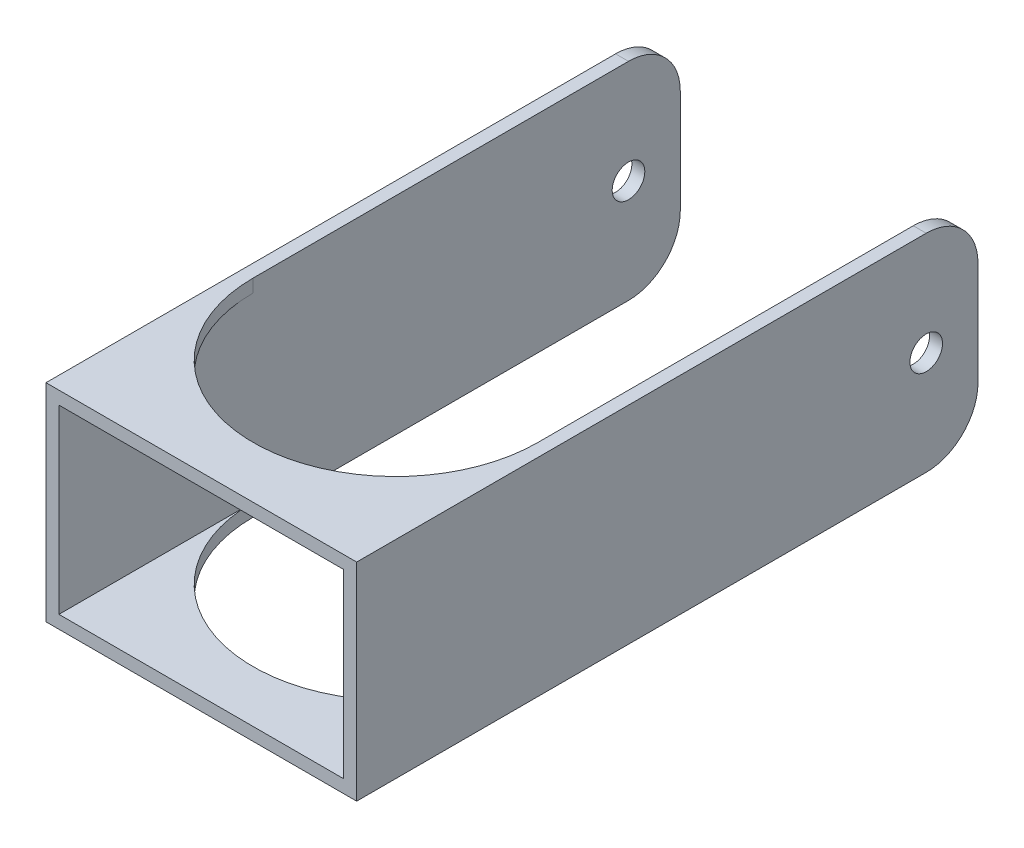
ISO-10303-21;
HEADER;
FILE_DESCRIPTION(('STEP AP214'),'2;1');
FILE_NAME('part.step','',(''),(''),'','','');
FILE_SCHEMA(('AUTOMOTIVE_DESIGN { 1 0 10303 214 1 1 1 1 }'));
ENDSEC;
DATA;
#1=APPLICATION_CONTEXT('core data for automotive mechanical design processes');
#2=APPLICATION_PROTOCOL_DEFINITION('international standard','automotive_design',2000,#1);
#3=PRODUCT_CONTEXT('',#1,'mechanical');
#4=PRODUCT('Part','Part','',(#3));
#5=PRODUCT_RELATED_PRODUCT_CATEGORY('part','',(#4));
#6=PRODUCT_DEFINITION_FORMATION('','',#4);
#7=PRODUCT_DEFINITION_CONTEXT('part definition',#1,'design');
#8=PRODUCT_DEFINITION('design','',#6,#7);
#9=PRODUCT_DEFINITION_SHAPE('','',#8);
#10=(LENGTH_UNIT() NAMED_UNIT(*) SI_UNIT(.MILLI.,.METRE.));
#11=(NAMED_UNIT(*) PLANE_ANGLE_UNIT() SI_UNIT($,.RADIAN.));
#12=(NAMED_UNIT(*) SI_UNIT($,.STERADIAN.) SOLID_ANGLE_UNIT());
#13=UNCERTAINTY_MEASURE_WITH_UNIT(LENGTH_MEASURE(1.E-05),#10,'distance_accuracy_value','');
#14=(GEOMETRIC_REPRESENTATION_CONTEXT(3) GLOBAL_UNCERTAINTY_ASSIGNED_CONTEXT((#13)) GLOBAL_UNIT_ASSIGNED_CONTEXT((#10,
#11,#12)) REPRESENTATION_CONTEXT('',''));
#15=CARTESIAN_POINT('',(0.,0.,0.));
#16=DIRECTION('',(0.,0.,1.));
#17=DIRECTION('',(1.,0.,0.));
#18=AXIS2_PLACEMENT_3D('',#15,#16,#17);
#19=CARTESIAN_POINT('',(0.,0.,-76.2));
#20=DIRECTION('',(0.,0.,1.));
#21=DIRECTION('',(1.,0.,0.));
#22=AXIS2_PLACEMENT_3D('',#19,#20,#21);
#23=PLANE('',#22);
#24=DIRECTION('',(0.,1.,0.));
#25=VECTOR('',#24,1.);
#26=CARTESIAN_POINT('',(38.1,-25.4,-76.2));
#27=LINE('',#26,#25);
#28=CARTESIAN_POINT('',(38.1,-12.7,-76.2));
#29=VERTEX_POINT('',#28);
#30=CARTESIAN_POINT('',(38.1,12.7,-76.2));
#31=VERTEX_POINT('',#30);
#32=EDGE_CURVE('E219',#29,#31,#27,.T.);
#33=ORIENTED_EDGE('',*,*,#32,.F.);
#34=DIRECTION('',(1.,0.,0.));
#35=VECTOR('',#34,1.);
#36=CARTESIAN_POINT('',(0.,-12.7,-76.2));
#37=LINE('',#36,#35);
#38=CARTESIAN_POINT('',(34.925,-12.7,-76.2));
#39=VERTEX_POINT('',#38);
#40=EDGE_CURVE('E61',#29,#39,#37,.F.);
#41=ORIENTED_EDGE('',*,*,#40,.T.);
#42=DIRECTION('',(0.,1.,0.));
#43=VECTOR('',#42,1.);
#44=CARTESIAN_POINT('',(34.925,-22.225,-76.2));
#45=LINE('',#44,#43);
#46=CARTESIAN_POINT('',(34.925,12.7,-76.2));
#47=VERTEX_POINT('',#46);
#48=EDGE_CURVE('E212',#39,#47,#45,.T.);
#49=ORIENTED_EDGE('',*,*,#48,.T.);
#50=DIRECTION('',(-1.,0.,0.));
#51=VECTOR('',#50,1.);
#52=CARTESIAN_POINT('',(0.,12.7,-76.2));
#53=LINE('',#52,#51);
#54=EDGE_CURVE('E327',#47,#31,#53,.F.);
#55=ORIENTED_EDGE('',*,*,#54,.T.);
#56=EDGE_LOOP('',(#33,#41,#49,#55));
#57=FACE_BOUND('',#56,.T.);
#58=ADVANCED_FACE('F39',(#57),#23,.F.);
#59=CARTESIAN_POINT('',(0.,0.,76.2));
#60=DIRECTION('',(0.,0.,1.));
#61=DIRECTION('',(1.,0.,0.));
#62=AXIS2_PLACEMENT_3D('',#59,#60,#61);
#63=PLANE('',#62);
#64=DIRECTION('',(0.,-1.,0.));
#65=VECTOR('',#64,1.);
#66=CARTESIAN_POINT('',(-38.1,-25.4,76.2));
#67=LINE('',#66,#65);
#68=CARTESIAN_POINT('',(-38.1,25.4,76.2));
#69=VERTEX_POINT('',#68);
#70=CARTESIAN_POINT('',(-38.1,-25.4,76.2));
#71=VERTEX_POINT('',#70);
#72=EDGE_CURVE('E250',#69,#71,#67,.T.);
#73=ORIENTED_EDGE('',*,*,#72,.T.);
#74=DIRECTION('',(1.,0.,0.));
#75=VECTOR('',#74,1.);
#76=CARTESIAN_POINT('',(38.1,-25.4,76.2));
#77=LINE('',#76,#75);
#78=CARTESIAN_POINT('',(38.1,-25.4,76.2));
#79=VERTEX_POINT('',#78);
#80=EDGE_CURVE('E254',#71,#79,#77,.T.);
#81=ORIENTED_EDGE('',*,*,#80,.T.);
#82=DIRECTION('',(0.,1.,0.));
#83=VECTOR('',#82,1.);
#84=CARTESIAN_POINT('',(38.1,-25.4,76.2));
#85=LINE('',#84,#83);
#86=CARTESIAN_POINT('',(38.1,25.4,76.2));
#87=VERTEX_POINT('',#86);
#88=EDGE_CURVE('E257',#79,#87,#85,.T.);
#89=ORIENTED_EDGE('',*,*,#88,.T.);
#90=DIRECTION('',(-1.,0.,0.));
#91=VECTOR('',#90,1.);
#92=CARTESIAN_POINT('',(38.1,25.4,76.2));
#93=LINE('',#92,#91);
#94=EDGE_CURVE('E260',#87,#69,#93,.T.);
#95=ORIENTED_EDGE('',*,*,#94,.T.);
#96=EDGE_LOOP('',(#73,#81,#89,#95));
#97=FACE_BOUND('',#96,.T.);
#98=DIRECTION('',(1.,0.,0.));
#99=VECTOR('',#98,1.);
#100=CARTESIAN_POINT('',(34.925,-22.225,76.2));
#101=LINE('',#100,#99);
#102=CARTESIAN_POINT('',(-34.925,-22.225,76.2));
#103=VERTEX_POINT('',#102);
#104=CARTESIAN_POINT('',(34.925,-22.225,76.2));
#105=VERTEX_POINT('',#104);
#106=EDGE_CURVE('E226',#103,#105,#101,.T.);
#107=ORIENTED_EDGE('',*,*,#106,.F.);
#108=DIRECTION('',(0.,-1.,0.));
#109=VECTOR('',#108,1.);
#110=CARTESIAN_POINT('',(-34.925,-22.225,76.2));
#111=LINE('',#110,#109);
#112=CARTESIAN_POINT('',(-34.925,22.225,76.2));
#113=VERTEX_POINT('',#112);
#114=EDGE_CURVE('E223',#113,#103,#111,.T.);
#115=ORIENTED_EDGE('',*,*,#114,.F.);
#116=DIRECTION('',(-1.,0.,0.));
#117=VECTOR('',#116,1.);
#118=CARTESIAN_POINT('',(34.925,22.225,76.2));
#119=LINE('',#118,#117);
#120=CARTESIAN_POINT('',(34.925,22.225,76.2));
#121=VERTEX_POINT('',#120);
#122=EDGE_CURVE('E233',#121,#113,#119,.T.);
#123=ORIENTED_EDGE('',*,*,#122,.F.);
#124=DIRECTION('',(0.,1.,0.));
#125=VECTOR('',#124,1.);
#126=CARTESIAN_POINT('',(34.925,-22.225,76.2));
#127=LINE('',#126,#125);
#128=EDGE_CURVE('E229',#105,#121,#127,.T.);
#129=ORIENTED_EDGE('',*,*,#128,.F.);
#130=EDGE_LOOP('',(#107,#115,#123,#129));
#131=FACE_BOUND('',#130,.T.);
#132=ADVANCED_FACE('F370',(#97,#131),#63,.T.);
#133=CARTESIAN_POINT('',(-38.1,-25.4,76.2));
#134=DIRECTION('',(1.,0.,0.));
#135=DIRECTION('',(0.,0.,-1.));
#136=AXIS2_PLACEMENT_3D('',#133,#134,#135);
#137=PLANE('',#136);
#138=CARTESIAN_POINT('',(-38.1,0.,-63.5));
#139=DIRECTION('',(1.,0.,0.));
#140=DIRECTION('',(0.,0.,-1.));
#141=AXIS2_PLACEMENT_3D('',#138,#139,#140);
#142=CIRCLE('',#141,4.00000000000001);
#143=CARTESIAN_POINT('',(-38.1,0.,-67.5));
#144=VERTEX_POINT('',#143);
#145=EDGE_CURVE('E289',#144,#144,#142,.T.);
#146=ORIENTED_EDGE('',*,*,#145,.T.);
#147=EDGE_LOOP('',(#146));
#148=FACE_BOUND('',#147,.T.);
#149=DIRECTION('',(0.,-1.,0.));
#150=VECTOR('',#149,1.);
#151=CARTESIAN_POINT('',(-38.1,-25.4,-76.2));
#152=LINE('',#151,#150);
#153=CARTESIAN_POINT('',(-38.1,12.7,-76.2));
#154=VERTEX_POINT('',#153);
#155=CARTESIAN_POINT('',(-38.1,-12.7,-76.2));
#156=VERTEX_POINT('',#155);
#157=EDGE_CURVE('E215',#154,#156,#152,.T.);
#158=ORIENTED_EDGE('',*,*,#157,.T.);
#159=CARTESIAN_POINT('',(-38.1,-12.7,-63.5000000000001));
#160=DIRECTION('',(1.,0.,0.));
#161=DIRECTION('',(0.,0.,-1.));
#162=AXIS2_PLACEMENT_3D('',#159,#160,#161);
#163=CIRCLE('',#162,12.7);
#164=CARTESIAN_POINT('',(-38.1,-25.4,-63.5000000000001));
#165=VERTEX_POINT('',#164);
#166=EDGE_CURVE('E310',#156,#165,#163,.F.);
#167=ORIENTED_EDGE('',*,*,#166,.T.);
#168=DIRECTION('',(0.,0.,-1.));
#169=VECTOR('',#168,1.);
#170=CARTESIAN_POINT('',(-38.1,-25.4,76.2));
#171=LINE('',#170,#169);
#172=EDGE_CURVE('E275',#71,#165,#171,.T.);
#173=ORIENTED_EDGE('',*,*,#172,.F.);
#174=ORIENTED_EDGE('',*,*,#72,.F.);
#175=DIRECTION('',(0.,0.,-1.));
#176=VECTOR('',#175,1.);
#177=CARTESIAN_POINT('',(-38.1,25.4,76.2));
#178=LINE('',#177,#176);
#179=CARTESIAN_POINT('',(-38.1,25.4,-63.5000000000001));
#180=VERTEX_POINT('',#179);
#181=EDGE_CURVE('E263',#69,#180,#178,.T.);
#182=ORIENTED_EDGE('',*,*,#181,.T.);
#183=CARTESIAN_POINT('',(-38.1,12.7,-63.5000000000001));
#184=DIRECTION('',(1.,0.,0.));
#185=DIRECTION('',(0.,0.,-1.));
#186=AXIS2_PLACEMENT_3D('',#183,#184,#185);
#187=CIRCLE('',#186,12.7);
#188=EDGE_CURVE('E307',#180,#154,#187,.F.);
#189=ORIENTED_EDGE('',*,*,#188,.T.);
#190=EDGE_LOOP('',(#158,#167,#173,#174,#182,#189));
#191=FACE_BOUND('',#190,.T.);
#192=ADVANCED_FACE('F357',(#148,#191),#137,.F.);
#193=CARTESIAN_POINT('',(38.1,-25.4,76.2));
#194=DIRECTION('',(0.,1.,0.));
#195=DIRECTION('',(0.,0.,1.));
#196=AXIS2_PLACEMENT_3D('',#193,#194,#195);
#197=PLANE('',#196);
#198=ORIENTED_EDGE('',*,*,#172,.T.);
#199=DIRECTION('',(1.,0.,0.));
#200=VECTOR('',#199,1.);
#201=CARTESIAN_POINT('',(38.1,-25.4,-63.5000000000001));
#202=LINE('',#201,#200);
#203=CARTESIAN_POINT('',(-34.925,-25.4,-63.5000000000001));
#204=VERTEX_POINT('',#203);
#205=EDGE_CURVE('E161',#165,#204,#202,.T.);
#206=ORIENTED_EDGE('',*,*,#205,.T.);
#207=DIRECTION('',(0.,0.,1.));
#208=VECTOR('',#207,1.);
#209=CARTESIAN_POINT('',(-34.925,-25.4,0.));
#210=LINE('',#209,#208);
#211=CARTESIAN_POINT('',(-34.925,-25.4,28.575));
#212=VERTEX_POINT('',#211);
#213=EDGE_CURVE('E153',#204,#212,#210,.T.);
#214=ORIENTED_EDGE('',*,*,#213,.T.);
#215=CARTESIAN_POINT('',(0.,-25.4,28.575));
#216=DIRECTION('',(0.,1.,0.));
#217=DIRECTION('',(0.,0.,1.));
#218=AXIS2_PLACEMENT_3D('',#215,#216,#217);
#219=CIRCLE('',#218,34.925);
#220=CARTESIAN_POINT('',(34.925,-25.4,28.575));
#221=VERTEX_POINT('',#220);
#222=EDGE_CURVE('E159',#212,#221,#219,.T.);
#223=ORIENTED_EDGE('',*,*,#222,.T.);
#224=DIRECTION('',(0.,0.,1.));
#225=VECTOR('',#224,1.);
#226=CARTESIAN_POINT('',(34.925,-25.4,0.));
#227=LINE('',#226,#225);
#228=CARTESIAN_POINT('',(34.925,-25.4,-63.5000000000001));
#229=VERTEX_POINT('',#228);
#230=EDGE_CURVE('E182',#229,#221,#227,.T.);
#231=ORIENTED_EDGE('',*,*,#230,.F.);
#232=DIRECTION('',(1.,0.,0.));
#233=VECTOR('',#232,1.);
#234=CARTESIAN_POINT('',(38.1,-25.4,-63.5000000000001));
#235=LINE('',#234,#233);
#236=CARTESIAN_POINT('',(38.1,-25.4,-63.5000000000001));
#237=VERTEX_POINT('',#236);
#238=EDGE_CURVE('E281',#229,#237,#235,.T.);
#239=ORIENTED_EDGE('',*,*,#238,.T.);
#240=DIRECTION('',(0.,0.,-1.));
#241=VECTOR('',#240,1.);
#242=CARTESIAN_POINT('',(38.1,-25.4,76.2));
#243=LINE('',#242,#241);
#244=EDGE_CURVE('E271',#79,#237,#243,.T.);
#245=ORIENTED_EDGE('',*,*,#244,.F.);
#246=ORIENTED_EDGE('',*,*,#80,.F.);
#247=EDGE_LOOP('',(#198,#206,#214,#223,#231,#239,#245,#246));
#248=FACE_BOUND('',#247,.T.);
#249=ADVANCED_FACE('F156',(#248),#197,.F.);
#250=CARTESIAN_POINT('',(38.1,-25.4,76.2));
#251=DIRECTION('',(-1.,0.,0.));
#252=DIRECTION('',(0.,0.,1.));
#253=AXIS2_PLACEMENT_3D('',#250,#251,#252);
#254=PLANE('',#253);
#255=CARTESIAN_POINT('',(38.1,0.,-63.5));
#256=DIRECTION('',(1.,0.,0.));
#257=DIRECTION('',(0.,0.,-1.));
#258=AXIS2_PLACEMENT_3D('',#255,#256,#257);
#259=CIRCLE('',#258,4.00000000000001);
#260=CARTESIAN_POINT('',(38.1,0.,-67.5));
#261=VERTEX_POINT('',#260);
#262=EDGE_CURVE('E552',#261,#261,#259,.T.);
#263=ORIENTED_EDGE('',*,*,#262,.F.);
#264=EDGE_LOOP('',(#263));
#265=FACE_BOUND('',#264,.T.);
#266=ORIENTED_EDGE('',*,*,#244,.T.);
#267=CARTESIAN_POINT('',(38.1,-12.7,-63.5000000000001));
#268=DIRECTION('',(-1.,0.,0.));
#269=DIRECTION('',(0.,0.,1.));
#270=AXIS2_PLACEMENT_3D('',#267,#268,#269);
#271=CIRCLE('',#270,12.7);
#272=EDGE_CURVE('E324',#237,#29,#271,.F.);
#273=ORIENTED_EDGE('',*,*,#272,.T.);
#274=ORIENTED_EDGE('',*,*,#32,.T.);
#275=CARTESIAN_POINT('',(38.1,12.7,-63.5000000000001));
#276=DIRECTION('',(-1.,0.,0.));
#277=DIRECTION('',(0.,0.,1.));
#278=AXIS2_PLACEMENT_3D('',#275,#276,#277);
#279=CIRCLE('',#278,12.7);
#280=CARTESIAN_POINT('',(38.1,25.4,-63.5000000000001));
#281=VERTEX_POINT('',#280);
#282=EDGE_CURVE('E321',#31,#281,#279,.F.);
#283=ORIENTED_EDGE('',*,*,#282,.T.);
#284=DIRECTION('',(0.,0.,-1.));
#285=VECTOR('',#284,1.);
#286=CARTESIAN_POINT('',(38.1,25.4,76.2));
#287=LINE('',#286,#285);
#288=EDGE_CURVE('E267',#87,#281,#287,.T.);
#289=ORIENTED_EDGE('',*,*,#288,.F.);
#290=ORIENTED_EDGE('',*,*,#88,.F.);
#291=EDGE_LOOP('',(#266,#273,#274,#283,#289,#290));
#292=FACE_BOUND('',#291,.T.);
#293=ADVANCED_FACE('F336',(#265,#292),#254,.F.);
#294=CARTESIAN_POINT('',(38.1,25.4,76.2));
#295=DIRECTION('',(0.,-1.,0.));
#296=DIRECTION('',(0.,0.,-1.));
#297=AXIS2_PLACEMENT_3D('',#294,#295,#296);
#298=PLANE('',#297);
#299=DIRECTION('',(0.,0.,-1.));
#300=VECTOR('',#299,1.);
#301=CARTESIAN_POINT('',(-34.925,25.4,76.2000000000001));
#302=LINE('',#301,#300);
#303=CARTESIAN_POINT('',(-34.925,25.4,28.575));
#304=VERTEX_POINT('',#303);
#305=CARTESIAN_POINT('',(-34.925,25.4,-63.5));
#306=VERTEX_POINT('',#305);
#307=EDGE_CURVE('E200',#304,#306,#302,.T.);
#308=ORIENTED_EDGE('',*,*,#307,.T.);
#309=DIRECTION('',(-1.,0.,0.));
#310=VECTOR('',#309,1.);
#311=CARTESIAN_POINT('',(38.1,25.4,-63.5000000000001));
#312=LINE('',#311,#310);
#313=EDGE_CURVE('E317',#306,#180,#312,.T.);
#314=ORIENTED_EDGE('',*,*,#313,.T.);
#315=ORIENTED_EDGE('',*,*,#181,.F.);
#316=ORIENTED_EDGE('',*,*,#94,.F.);
#317=ORIENTED_EDGE('',*,*,#288,.T.);
#318=DIRECTION('',(-1.,0.,0.));
#319=VECTOR('',#318,1.);
#320=CARTESIAN_POINT('',(38.1,25.4,-63.5000000000001));
#321=LINE('',#320,#319);
#322=CARTESIAN_POINT('',(34.925,25.4,-63.5000000000001));
#323=VERTEX_POINT('',#322);
#324=EDGE_CURVE('E313',#281,#323,#321,.T.);
#325=ORIENTED_EDGE('',*,*,#324,.T.);
#326=DIRECTION('',(0.,0.,-1.));
#327=VECTOR('',#326,1.);
#328=CARTESIAN_POINT('',(34.925,25.4,76.2));
#329=LINE('',#328,#327);
#330=CARTESIAN_POINT('',(34.925,25.4,28.575));
#331=VERTEX_POINT('',#330);
#332=EDGE_CURVE('E194',#331,#323,#329,.T.);
#333=ORIENTED_EDGE('',*,*,#332,.F.);
#334=CARTESIAN_POINT('',(0.,25.4,28.575));
#335=DIRECTION('',(0.,1.,0.));
#336=DIRECTION('',(0.,0.,1.));
#337=AXIS2_PLACEMENT_3D('',#334,#335,#336);
#338=CIRCLE('',#337,34.925);
#339=EDGE_CURVE('E207',#304,#331,#338,.T.);
#340=ORIENTED_EDGE('',*,*,#339,.F.);
#341=EDGE_LOOP('',(#308,#314,#315,#316,#317,#325,#333,#340));
#342=FACE_BOUND('',#341,.T.);
#343=ADVANCED_FACE('F341',(#342),#298,.F.);
#344=CARTESIAN_POINT('',(-34.925,-22.225,76.2));
#345=DIRECTION('',(1.,0.,0.));
#346=DIRECTION('',(0.,0.,-1.));
#347=AXIS2_PLACEMENT_3D('',#344,#345,#346);
#348=PLANE('',#347);
#349=CARTESIAN_POINT('',(-34.925,0.,-63.5));
#350=DIRECTION('',(1.,0.,0.));
#351=DIRECTION('',(0.,0.,-1.));
#352=AXIS2_PLACEMENT_3D('',#349,#350,#351);
#353=CIRCLE('',#352,4.00000000000001);
#354=CARTESIAN_POINT('',(-34.925,0.,-67.5));
#355=VERTEX_POINT('',#354);
#356=EDGE_CURVE('E164',#355,#355,#353,.T.);
#357=ORIENTED_EDGE('',*,*,#356,.F.);
#358=EDGE_LOOP('',(#357));
#359=FACE_BOUND('',#358,.T.);
#360=ORIENTED_EDGE('',*,*,#213,.F.);
#361=CARTESIAN_POINT('',(-34.925,-12.7,-63.5000000000001));
#362=DIRECTION('',(1.,0.,0.));
#363=DIRECTION('',(0.,0.,-1.));
#364=AXIS2_PLACEMENT_3D('',#361,#362,#363);
#365=CIRCLE('',#364,12.7);
#366=CARTESIAN_POINT('',(-34.925,-12.7,-76.2));
#367=VERTEX_POINT('',#366);
#368=EDGE_CURVE('E298',#204,#367,#365,.T.);
#369=ORIENTED_EDGE('',*,*,#368,.T.);
#370=DIRECTION('',(0.,-1.,0.));
#371=VECTOR('',#370,1.);
#372=CARTESIAN_POINT('',(-34.925,-22.225,-76.2));
#373=LINE('',#372,#371);
#374=CARTESIAN_POINT('',(-34.925,12.7,-76.2));
#375=VERTEX_POINT('',#374);
#376=EDGE_CURVE('E208',#375,#367,#373,.T.);
#377=ORIENTED_EDGE('',*,*,#376,.F.);
#378=CARTESIAN_POINT('',(-34.925,12.7,-63.5000000000001));
#379=DIRECTION('',(1.,0.,0.));
#380=DIRECTION('',(0.,0.,-1.));
#381=AXIS2_PLACEMENT_3D('',#378,#379,#380);
#382=CIRCLE('',#381,12.7);
#383=EDGE_CURVE('E295',#375,#306,#382,.T.);
#384=ORIENTED_EDGE('',*,*,#383,.T.);
#385=ORIENTED_EDGE('',*,*,#307,.F.);
#386=DIRECTION('',(0.,1.,0.));
#387=VECTOR('',#386,1.);
#388=CARTESIAN_POINT('',(-34.925,-25.4,28.575));
#389=LINE('',#388,#387);
#390=CARTESIAN_POINT('',(-34.925,22.225,28.575));
#391=VERTEX_POINT('',#390);
#392=EDGE_CURVE('E175',#391,#304,#389,.T.);
#393=ORIENTED_EDGE('',*,*,#392,.F.);
#394=DIRECTION('',(0.,0.,-1.));
#395=VECTOR('',#394,1.);
#396=CARTESIAN_POINT('',(-34.925,22.225,76.2));
#397=LINE('',#396,#395);
#398=EDGE_CURVE('E236',#113,#391,#397,.T.);
#399=ORIENTED_EDGE('',*,*,#398,.F.);
#400=ORIENTED_EDGE('',*,*,#114,.T.);
#401=DIRECTION('',(0.,0.,-1.));
#402=VECTOR('',#401,1.);
#403=CARTESIAN_POINT('',(-34.925,-22.225,76.2));
#404=LINE('',#403,#402);
#405=CARTESIAN_POINT('',(-34.925,-22.225,28.575));
#406=VERTEX_POINT('',#405);
#407=EDGE_CURVE('E170',#103,#406,#404,.T.);
#408=ORIENTED_EDGE('',*,*,#407,.T.);
#409=EDGE_CURVE('E167',#212,#406,#389,.T.);
#410=ORIENTED_EDGE('',*,*,#409,.F.);
#411=EDGE_LOOP('',(#360,#369,#377,#384,#385,#393,#399,#400,#408,#410));
#412=FACE_BOUND('',#411,.T.);
#413=ADVANCED_FACE('F168',(#359,#412),#348,.T.);
#414=CARTESIAN_POINT('',(34.925,-22.225,76.2));
#415=DIRECTION('',(0.,1.,0.));
#416=DIRECTION('',(0.,0.,1.));
#417=AXIS2_PLACEMENT_3D('',#414,#415,#416);
#418=PLANE('',#417);
#419=CARTESIAN_POINT('',(0.,-22.225,28.575));
#420=DIRECTION('',(0.,1.,0.));
#421=DIRECTION('',(0.,0.,1.));
#422=AXIS2_PLACEMENT_3D('',#419,#420,#421);
#423=CIRCLE('',#422,34.925);
#424=CARTESIAN_POINT('',(34.925,-22.225,28.575));
#425=VERTEX_POINT('',#424);
#426=EDGE_CURVE('E204',#406,#425,#423,.T.);
#427=ORIENTED_EDGE('',*,*,#426,.F.);
#428=ORIENTED_EDGE('',*,*,#407,.F.);
#429=ORIENTED_EDGE('',*,*,#106,.T.);
#430=DIRECTION('',(0.,0.,-1.));
#431=VECTOR('',#430,1.);
#432=CARTESIAN_POINT('',(34.925,-22.225,76.2));
#433=LINE('',#432,#431);
#434=EDGE_CURVE('E244',#105,#425,#433,.T.);
#435=ORIENTED_EDGE('',*,*,#434,.T.);
#436=EDGE_LOOP('',(#427,#428,#429,#435));
#437=FACE_BOUND('',#436,.T.);
#438=ADVANCED_FACE('F380',(#437),#418,.T.);
#439=CARTESIAN_POINT('',(34.925,-22.225,76.2));
#440=DIRECTION('',(-1.,0.,0.));
#441=DIRECTION('',(0.,-1.,0.));
#442=AXIS2_PLACEMENT_3D('',#439,#440,#441);
#443=PLANE('',#442);
#444=CARTESIAN_POINT('',(34.925,0.,-63.5));
#445=DIRECTION('',(-1.,0.,0.));
#446=DIRECTION('',(0.,-1.,0.));
#447=AXIS2_PLACEMENT_3D('',#444,#445,#446);
#448=CIRCLE('',#447,4.00000000000001);
#449=CARTESIAN_POINT('',(34.925,-4.00000000000001,-63.5));
#450=VERTEX_POINT('',#449);
#451=EDGE_CURVE('E285',#450,#450,#448,.T.);
#452=ORIENTED_EDGE('',*,*,#451,.F.);
#453=EDGE_LOOP('',(#452));
#454=FACE_BOUND('',#453,.T.);
#455=ORIENTED_EDGE('',*,*,#48,.F.);
#456=CARTESIAN_POINT('',(34.925,-12.7,-63.5000000000001));
#457=DIRECTION('',(-1.,0.,0.));
#458=DIRECTION('',(0.,-1.,0.));
#459=AXIS2_PLACEMENT_3D('',#456,#457,#458);
#460=CIRCLE('',#459,12.7);
#461=EDGE_CURVE('E11',#39,#229,#460,.T.);
#462=ORIENTED_EDGE('',*,*,#461,.T.);
#463=ORIENTED_EDGE('',*,*,#230,.T.);
#464=DIRECTION('',(0.,1.,0.));
#465=VECTOR('',#464,1.);
#466=CARTESIAN_POINT('',(34.925,-25.4,28.575));
#467=LINE('',#466,#465);
#468=EDGE_CURVE('E180',#221,#425,#467,.T.);
#469=ORIENTED_EDGE('',*,*,#468,.T.);
#470=ORIENTED_EDGE('',*,*,#434,.F.);
#471=ORIENTED_EDGE('',*,*,#128,.T.);
#472=DIRECTION('',(0.,0.,-1.));
#473=VECTOR('',#472,1.);
#474=CARTESIAN_POINT('',(34.925,22.225,76.2));
#475=LINE('',#474,#473);
#476=CARTESIAN_POINT('',(34.925,22.225,28.575));
#477=VERTEX_POINT('',#476);
#478=EDGE_CURVE('E240',#121,#477,#475,.T.);
#479=ORIENTED_EDGE('',*,*,#478,.T.);
#480=EDGE_CURVE('E174',#477,#331,#467,.T.);
#481=ORIENTED_EDGE('',*,*,#480,.T.);
#482=ORIENTED_EDGE('',*,*,#332,.T.);
#483=CARTESIAN_POINT('',(34.925,12.7,-63.5000000000001));
#484=DIRECTION('',(-1.,0.,0.));
#485=DIRECTION('',(0.,-1.,0.));
#486=AXIS2_PLACEMENT_3D('',#483,#484,#485);
#487=CIRCLE('',#486,12.7);
#488=EDGE_CURVE('E48',#323,#47,#487,.T.);
#489=ORIENTED_EDGE('',*,*,#488,.T.);
#490=EDGE_LOOP('',(#455,#462,#463,#469,#470,#471,#479,#481,#482,#489));
#491=FACE_BOUND('',#490,.T.);
#492=ADVANCED_FACE('F344',(#454,#491),#443,.T.);
#493=CARTESIAN_POINT('',(34.925,22.225,76.2));
#494=DIRECTION('',(0.,-1.,0.));
#495=DIRECTION('',(0.,0.,-1.));
#496=AXIS2_PLACEMENT_3D('',#493,#494,#495);
#497=PLANE('',#496);
#498=CARTESIAN_POINT('',(0.,22.225,28.575));
#499=DIRECTION('',(0.,-1.,0.));
#500=DIRECTION('',(0.,0.,-1.));
#501=AXIS2_PLACEMENT_3D('',#498,#499,#500);
#502=CIRCLE('',#501,34.925);
#503=EDGE_CURVE('E278',#477,#391,#502,.T.);
#504=ORIENTED_EDGE('',*,*,#503,.F.);
#505=ORIENTED_EDGE('',*,*,#478,.F.);
#506=ORIENTED_EDGE('',*,*,#122,.T.);
#507=ORIENTED_EDGE('',*,*,#398,.T.);
#508=EDGE_LOOP('',(#504,#505,#506,#507));
#509=FACE_BOUND('',#508,.T.);
#510=ADVANCED_FACE('F398',(#509),#497,.T.);
#511=ORIENTED_EDGE('',*,*,#376,.T.);
#512=DIRECTION('',(1.,0.,0.));
#513=VECTOR('',#512,1.);
#514=CARTESIAN_POINT('',(0.,-12.7,-76.2));
#515=LINE('',#514,#513);
#516=EDGE_CURVE('E304',#367,#156,#515,.F.);
#517=ORIENTED_EDGE('',*,*,#516,.T.);
#518=ORIENTED_EDGE('',*,*,#157,.F.);
#519=DIRECTION('',(-1.,0.,0.));
#520=VECTOR('',#519,1.);
#521=CARTESIAN_POINT('',(0.,12.7,-76.2));
#522=LINE('',#521,#520);
#523=EDGE_CURVE('E301',#154,#375,#522,.F.);
#524=ORIENTED_EDGE('',*,*,#523,.T.);
#525=EDGE_LOOP('',(#511,#517,#518,#524));
#526=FACE_BOUND('',#525,.T.);
#527=ADVANCED_FACE('F361',(#526),#23,.F.);
#528=CARTESIAN_POINT('',(0.,-25.4,28.575));
#529=DIRECTION('',(0.,1.,0.));
#530=DIRECTION('',(0.,0.,1.));
#531=AXIS2_PLACEMENT_3D('',#528,#529,#530);
#532=CYLINDRICAL_SURFACE('',#531,34.925);
#533=ORIENTED_EDGE('',*,*,#426,.T.);
#534=ORIENTED_EDGE('',*,*,#468,.F.);
#535=ORIENTED_EDGE('',*,*,#222,.F.);
#536=ORIENTED_EDGE('',*,*,#409,.T.);
#537=EDGE_LOOP('',(#533,#534,#535,#536));
#538=FACE_BOUND('',#537,.T.);
#539=ADVANCED_FACE('F178',(#538),#532,.F.);
#540=ORIENTED_EDGE('',*,*,#480,.F.);
#541=ORIENTED_EDGE('',*,*,#503,.T.);
#542=ORIENTED_EDGE('',*,*,#392,.T.);
#543=ORIENTED_EDGE('',*,*,#339,.T.);
#544=EDGE_LOOP('',(#540,#541,#542,#543));
#545=FACE_BOUND('',#544,.T.);
#546=ADVANCED_FACE('F347',(#545),#532,.F.);
#547=CARTESIAN_POINT('',(-38.1,0.,-63.5));
#548=DIRECTION('',(1.,0.,0.));
#549=DIRECTION('',(0.,0.,-1.));
#550=AXIS2_PLACEMENT_3D('',#547,#548,#549);
#551=CYLINDRICAL_SURFACE('',#550,4.00000000000001);
#552=ORIENTED_EDGE('',*,*,#451,.T.);
#553=EDGE_LOOP('',(#552));
#554=FACE_BOUND('',#553,.T.);
#555=ORIENTED_EDGE('',*,*,#262,.T.);
#556=EDGE_LOOP('',(#555));
#557=FACE_BOUND('',#556,.T.);
#558=ADVANCED_FACE('F430',(#554,#557),#551,.F.);
#559=ORIENTED_EDGE('',*,*,#356,.T.);
#560=EDGE_LOOP('',(#559));
#561=FACE_BOUND('',#560,.T.);
#562=ORIENTED_EDGE('',*,*,#145,.F.);
#563=EDGE_LOOP('',(#562));
#564=FACE_BOUND('',#563,.T.);
#565=ADVANCED_FACE('F426',(#561,#564),#551,.F.);
#566=CARTESIAN_POINT('',(38.1,-12.7,-63.5000000000001));
#567=DIRECTION('',(1.,0.,0.));
#568=DIRECTION('',(0.,0.,-1.));
#569=AXIS2_PLACEMENT_3D('',#566,#567,#568);
#570=CYLINDRICAL_SURFACE('',#569,12.7);
#571=ORIENTED_EDGE('',*,*,#166,.F.);
#572=ORIENTED_EDGE('',*,*,#516,.F.);
#573=ORIENTED_EDGE('',*,*,#368,.F.);
#574=ORIENTED_EDGE('',*,*,#205,.F.);
#575=EDGE_LOOP('',(#571,#572,#573,#574));
#576=FACE_BOUND('',#575,.T.);
#577=ADVANCED_FACE('F365',(#576),#570,.T.);
#578=CARTESIAN_POINT('',(38.1,12.7,-63.5000000000001));
#579=DIRECTION('',(-1.,0.,0.));
#580=DIRECTION('',(0.,0.,1.));
#581=AXIS2_PLACEMENT_3D('',#578,#579,#580);
#582=CYLINDRICAL_SURFACE('',#581,12.7);
#583=ORIENTED_EDGE('',*,*,#383,.F.);
#584=ORIENTED_EDGE('',*,*,#523,.F.);
#585=ORIENTED_EDGE('',*,*,#188,.F.);
#586=ORIENTED_EDGE('',*,*,#313,.F.);
#587=EDGE_LOOP('',(#583,#584,#585,#586));
#588=FACE_BOUND('',#587,.T.);
#589=ADVANCED_FACE('F353',(#588),#582,.T.);
#590=CARTESIAN_POINT('',(38.1,-12.7,-63.5000000000001));
#591=DIRECTION('',(1.,0.,0.));
#592=DIRECTION('',(0.,0.,-1.));
#593=AXIS2_PLACEMENT_3D('',#590,#591,#592);
#594=CYLINDRICAL_SURFACE('',#593,12.7);
#595=ORIENTED_EDGE('',*,*,#461,.F.);
#596=ORIENTED_EDGE('',*,*,#40,.F.);
#597=ORIENTED_EDGE('',*,*,#272,.F.);
#598=ORIENTED_EDGE('',*,*,#238,.F.);
#599=EDGE_LOOP('',(#595,#596,#597,#598));
#600=FACE_BOUND('',#599,.T.);
#601=ADVANCED_FACE('F384',(#600),#594,.T.);
#602=CARTESIAN_POINT('',(38.1,12.7,-63.5000000000001));
#603=DIRECTION('',(-1.,0.,0.));
#604=DIRECTION('',(0.,0.,1.));
#605=AXIS2_PLACEMENT_3D('',#602,#603,#604);
#606=CYLINDRICAL_SURFACE('',#605,12.7);
#607=ORIENTED_EDGE('',*,*,#282,.F.);
#608=ORIENTED_EDGE('',*,*,#54,.F.);
#609=ORIENTED_EDGE('',*,*,#488,.F.);
#610=ORIENTED_EDGE('',*,*,#324,.F.);
#611=EDGE_LOOP('',(#607,#608,#609,#610));
#612=FACE_BOUND('',#611,.T.);
#613=ADVANCED_FACE('F41',(#612),#606,.T.);
#614=CLOSED_SHELL('',(#58,#132,#192,#249,#293,#343,#413,#438,#492,#510,#527,#539,#546,#558,#565,
#577,#589,#601,#613));
#615=MANIFOLD_SOLID_BREP('B2',#614);
#616=ADVANCED_BREP_SHAPE_REPRESENTATION('',(#18,#615),#14);
#617=SHAPE_DEFINITION_REPRESENTATION(#9,#616);
ENDSEC;
END-ISO-10303-21;
